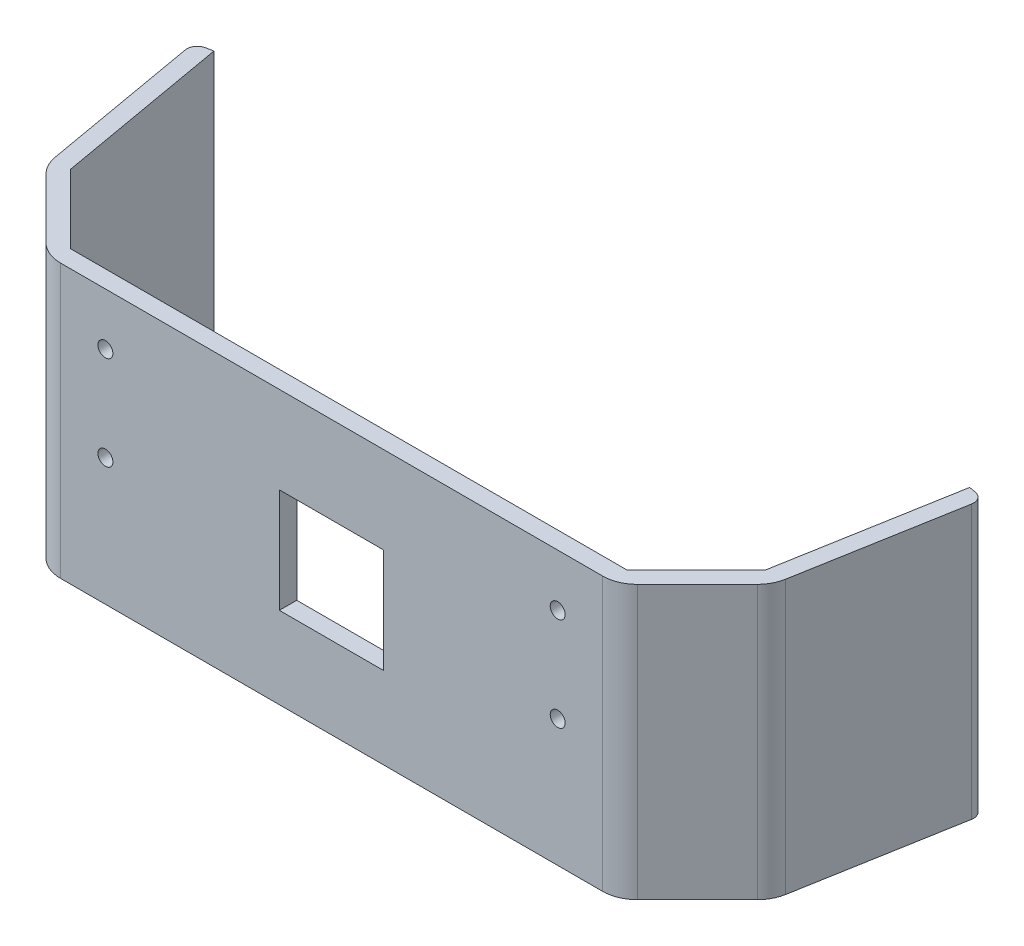
ISO-10303-21;
HEADER;
FILE_DESCRIPTION(('STEP AP214'),'2;1');
FILE_NAME('part.step','',(''),(''),'','','');
FILE_SCHEMA(('AUTOMOTIVE_DESIGN { 1 0 10303 214 1 1 1 1 }'));
ENDSEC;
DATA;
#1=APPLICATION_CONTEXT('core data for automotive mechanical design processes');
#2=APPLICATION_PROTOCOL_DEFINITION('international standard','automotive_design',2000,#1);
#3=PRODUCT_CONTEXT('',#1,'mechanical');
#4=PRODUCT('Part','Part','',(#3));
#5=PRODUCT_RELATED_PRODUCT_CATEGORY('part','',(#4));
#6=PRODUCT_DEFINITION_FORMATION('','',#4);
#7=PRODUCT_DEFINITION_CONTEXT('part definition',#1,'design');
#8=PRODUCT_DEFINITION('design','',#6,#7);
#9=PRODUCT_DEFINITION_SHAPE('','',#8);
#10=(LENGTH_UNIT() NAMED_UNIT(*) SI_UNIT(.MILLI.,.METRE.));
#11=(NAMED_UNIT(*) PLANE_ANGLE_UNIT() SI_UNIT($,.RADIAN.));
#12=(NAMED_UNIT(*) SI_UNIT($,.STERADIAN.) SOLID_ANGLE_UNIT());
#13=UNCERTAINTY_MEASURE_WITH_UNIT(LENGTH_MEASURE(1.E-05),#10,'distance_accuracy_value','');
#14=(GEOMETRIC_REPRESENTATION_CONTEXT(3) GLOBAL_UNCERTAINTY_ASSIGNED_CONTEXT((#13)) GLOBAL_UNIT_ASSIGNED_CONTEXT((#10,
#11,#12)) REPRESENTATION_CONTEXT('',''));
#15=CARTESIAN_POINT('',(0.,0.,0.));
#16=DIRECTION('',(0.,0.,1.));
#17=DIRECTION('',(1.,0.,0.));
#18=AXIS2_PLACEMENT_3D('',#15,#16,#17);
#19=CARTESIAN_POINT('',(99.7989898732233,78.5,-19.7989898732234));
#20=DIRECTION('',(-0.984807753012209,0.,-0.173648177666926));
#21=DIRECTION('',(-0.173648177666926,0.,0.984807753012209));
#22=AXIS2_PLACEMENT_3D('',#19,#20,#21);
#23=PLANE('',#22);
#24=DIRECTION('',(0.173648177666926,0.,-0.984807753012209));
#25=VECTOR('',#24,1.);
#26=CARTESIAN_POINT('',(99.7989898732233,0.,-19.7989898732234));
#27=LINE('',#26,#25);
#28=CARTESIAN_POINT('',(99.7989898732233,0.,-19.7989898732234));
#29=VERTEX_POINT('',#28);
#30=CARTESIAN_POINT('',(108.615338908646,0.,-69.7989898732234));
#31=VERTEX_POINT('',#30);
#32=EDGE_CURVE('E225',#29,#31,#27,.T.);
#33=ORIENTED_EDGE('',*,*,#32,.F.);
#34=DIRECTION('',(0.,-1.,0.));
#35=VECTOR('',#34,1.);
#36=CARTESIAN_POINT('',(99.7989898732233,78.5,-19.7989898732234));
#37=LINE('',#36,#35);
#38=CARTESIAN_POINT('',(99.7989898732233,78.5,-19.7989898732234));
#39=VERTEX_POINT('',#38);
#40=EDGE_CURVE('E287',#39,#29,#37,.T.);
#41=ORIENTED_EDGE('',*,*,#40,.F.);
#42=DIRECTION('',(0.173648177666926,0.,-0.984807753012209));
#43=VECTOR('',#42,1.);
#44=CARTESIAN_POINT('',(99.7989898732233,78.5,-19.7989898732234));
#45=LINE('',#44,#43);
#46=CARTESIAN_POINT('',(108.615338908646,78.5,-69.7989898732234));
#47=VERTEX_POINT('',#46);
#48=EDGE_CURVE('E221',#39,#47,#45,.T.);
#49=ORIENTED_EDGE('',*,*,#48,.T.);
#50=DIRECTION('',(0.,-1.,0.));
#51=VECTOR('',#50,1.);
#52=CARTESIAN_POINT('',(108.615338908646,78.5,-69.7989898732234));
#53=LINE('',#52,#51);
#54=EDGE_CURVE('E260',#47,#31,#53,.T.);
#55=ORIENTED_EDGE('',*,*,#54,.T.);
#56=EDGE_LOOP('',(#33,#41,#49,#55));
#57=FACE_BOUND('',#56,.T.);
#58=ADVANCED_FACE('F39',(#57),#23,.T.);
#59=CARTESIAN_POINT('',(80.,78.5,0.));
#60=DIRECTION('',(-0.70710678118655,0.,-0.707106781186545));
#61=DIRECTION('',(-0.707106781186545,0.,0.70710678118655));
#62=AXIS2_PLACEMENT_3D('',#59,#60,#61);
#63=PLANE('',#62);
#64=DIRECTION('',(0.707106781186545,0.,-0.70710678118655));
#65=VECTOR('',#64,1.);
#66=CARTESIAN_POINT('',(80.,0.,0.));
#67=LINE('',#66,#65);
#68=CARTESIAN_POINT('',(80.,0.,0.));
#69=VERTEX_POINT('',#68);
#70=EDGE_CURVE('E227',#69,#29,#67,.T.);
#71=ORIENTED_EDGE('',*,*,#70,.F.);
#72=DIRECTION('',(0.,-1.,0.));
#73=VECTOR('',#72,1.);
#74=CARTESIAN_POINT('',(80.,78.5,0.));
#75=LINE('',#74,#73);
#76=CARTESIAN_POINT('',(80.,78.5,0.));
#77=VERTEX_POINT('',#76);
#78=EDGE_CURVE('E292',#77,#69,#75,.T.);
#79=ORIENTED_EDGE('',*,*,#78,.F.);
#80=DIRECTION('',(0.707106781186545,0.,-0.70710678118655));
#81=VECTOR('',#80,1.);
#82=CARTESIAN_POINT('',(80.,78.5,0.));
#83=LINE('',#82,#81);
#84=EDGE_CURVE('E251',#77,#39,#83,.T.);
#85=ORIENTED_EDGE('',*,*,#84,.T.);
#86=ORIENTED_EDGE('',*,*,#40,.T.);
#87=EDGE_LOOP('',(#71,#79,#85,#86));
#88=FACE_BOUND('',#87,.T.);
#89=ADVANCED_FACE('F412',(#88),#63,.T.);
#90=CARTESIAN_POINT('',(-80.,78.5,0.));
#91=DIRECTION('',(0.,0.,-1.));
#92=DIRECTION('',(-1.,0.,0.));
#93=AXIS2_PLACEMENT_3D('',#90,#91,#92);
#94=PLANE('',#93);
#95=CARTESIAN_POINT('',(-65.,36.5,0.));
#96=DIRECTION('',(0.,0.,-1.));
#97=DIRECTION('',(-1.,0.,0.));
#98=AXIS2_PLACEMENT_3D('',#95,#96,#97);
#99=CIRCLE('',#98,2.15);
#100=CARTESIAN_POINT('',(-67.15,36.5,0.));
#101=VERTEX_POINT('',#100);
#102=EDGE_CURVE('E699',#101,#101,#99,.T.);
#103=ORIENTED_EDGE('',*,*,#102,.F.);
#104=EDGE_LOOP('',(#103));
#105=FACE_BOUND('',#104,.T.);
#106=CARTESIAN_POINT('',(-65.,63.5,0.));
#107=DIRECTION('',(0.,0.,-1.));
#108=DIRECTION('',(-1.,0.,0.));
#109=AXIS2_PLACEMENT_3D('',#106,#107,#108);
#110=CIRCLE('',#109,2.15);
#111=CARTESIAN_POINT('',(-67.15,63.5,0.));
#112=VERTEX_POINT('',#111);
#113=EDGE_CURVE('E700',#112,#112,#110,.T.);
#114=ORIENTED_EDGE('',*,*,#113,.F.);
#115=EDGE_LOOP('',(#114));
#116=FACE_BOUND('',#115,.T.);
#117=CARTESIAN_POINT('',(65.,63.5,0.));
#118=DIRECTION('',(0.,0.,-1.));
#119=DIRECTION('',(-1.,0.,0.));
#120=AXIS2_PLACEMENT_3D('',#117,#118,#119);
#121=CIRCLE('',#120,2.15);
#122=CARTESIAN_POINT('',(62.85,63.5,0.));
#123=VERTEX_POINT('',#122);
#124=EDGE_CURVE('E689',#123,#123,#121,.T.);
#125=ORIENTED_EDGE('',*,*,#124,.F.);
#126=EDGE_LOOP('',(#125));
#127=FACE_BOUND('',#126,.T.);
#128=CARTESIAN_POINT('',(65.,36.5,0.));
#129=DIRECTION('',(0.,0.,-1.));
#130=DIRECTION('',(-1.,0.,0.));
#131=AXIS2_PLACEMENT_3D('',#128,#129,#130);
#132=CIRCLE('',#131,2.15);
#133=CARTESIAN_POINT('',(62.85,36.5,0.));
#134=VERTEX_POINT('',#133);
#135=EDGE_CURVE('E688',#134,#134,#132,.T.);
#136=ORIENTED_EDGE('',*,*,#135,.F.);
#137=EDGE_LOOP('',(#136));
#138=FACE_BOUND('',#137,.T.);
#139=DIRECTION('',(-1.,0.,0.));
#140=VECTOR('',#139,1.);
#141=CARTESIAN_POINT('',(-80.,23.5,0.));
#142=LINE('',#141,#140);
#143=CARTESIAN_POINT('',(15.,23.5,0.));
#144=VERTEX_POINT('',#143);
#145=CARTESIAN_POINT('',(-15.,23.5,0.));
#146=VERTEX_POINT('',#145);
#147=EDGE_CURVE('E217',#144,#146,#142,.T.);
#148=ORIENTED_EDGE('',*,*,#147,.F.);
#149=DIRECTION('',(0.,1.,0.));
#150=VECTOR('',#149,1.);
#151=CARTESIAN_POINT('',(15.,78.5,0.));
#152=LINE('',#151,#150);
#153=CARTESIAN_POINT('',(15.,53.5,0.));
#154=VERTEX_POINT('',#153);
#155=EDGE_CURVE('E214',#144,#154,#152,.T.);
#156=ORIENTED_EDGE('',*,*,#155,.T.);
#157=DIRECTION('',(-1.,0.,0.));
#158=VECTOR('',#157,1.);
#159=CARTESIAN_POINT('',(-80.,53.5,0.));
#160=LINE('',#159,#158);
#161=CARTESIAN_POINT('',(-15.,53.5,0.));
#162=VERTEX_POINT('',#161);
#163=EDGE_CURVE('E194',#154,#162,#160,.T.);
#164=ORIENTED_EDGE('',*,*,#163,.T.);
#165=DIRECTION('',(0.,1.,0.));
#166=VECTOR('',#165,1.);
#167=CARTESIAN_POINT('',(-15.,78.5,0.));
#168=LINE('',#167,#166);
#169=EDGE_CURVE('E216',#146,#162,#168,.T.);
#170=ORIENTED_EDGE('',*,*,#169,.F.);
#171=EDGE_LOOP('',(#148,#156,#164,#170));
#172=FACE_BOUND('',#171,.T.);
#173=DIRECTION('',(1.,0.,0.));
#174=VECTOR('',#173,1.);
#175=CARTESIAN_POINT('',(-80.,0.,0.));
#176=LINE('',#175,#174);
#177=CARTESIAN_POINT('',(-80.,0.,0.));
#178=VERTEX_POINT('',#177);
#179=EDGE_CURVE('E284',#178,#69,#176,.T.);
#180=ORIENTED_EDGE('',*,*,#179,.F.);
#181=DIRECTION('',(0.,-1.,0.));
#182=VECTOR('',#181,1.);
#183=CARTESIAN_POINT('',(-80.,78.5,0.));
#184=LINE('',#183,#182);
#185=CARTESIAN_POINT('',(-80.,78.5,0.));
#186=VERTEX_POINT('',#185);
#187=EDGE_CURVE('E295',#186,#178,#184,.T.);
#188=ORIENTED_EDGE('',*,*,#187,.F.);
#189=DIRECTION('',(1.,0.,0.));
#190=VECTOR('',#189,1.);
#191=CARTESIAN_POINT('',(-80.,78.5,0.));
#192=LINE('',#191,#190);
#193=EDGE_CURVE('E252',#186,#77,#192,.T.);
#194=ORIENTED_EDGE('',*,*,#193,.T.);
#195=ORIENTED_EDGE('',*,*,#78,.T.);
#196=EDGE_LOOP('',(#180,#188,#194,#195));
#197=FACE_BOUND('',#196,.T.);
#198=ADVANCED_FACE('F416',(#105,#116,#127,#138,#172,#197),#94,.T.);
#199=CARTESIAN_POINT('',(-80.,78.5,0.));
#200=DIRECTION('',(-0.707106781186543,0.,0.707106781186552));
#201=DIRECTION('',(0.707106781186552,0.,0.707106781186543));
#202=AXIS2_PLACEMENT_3D('',#199,#200,#201);
#203=PLANE('',#202);
#204=DIRECTION('',(-0.707106781186551,0.,-0.707106781186543));
#205=VECTOR('',#204,1.);
#206=CARTESIAN_POINT('',(-80.,0.,0.));
#207=LINE('',#206,#205);
#208=CARTESIAN_POINT('',(-99.7989898732234,0.,-19.7989898732232));
#209=VERTEX_POINT('',#208);
#210=EDGE_CURVE('E285',#178,#209,#207,.T.);
#211=ORIENTED_EDGE('',*,*,#210,.T.);
#212=DIRECTION('',(0.,-1.,0.));
#213=VECTOR('',#212,1.);
#214=CARTESIAN_POINT('',(-99.7989898732234,78.5,-19.7989898732232));
#215=LINE('',#214,#213);
#216=CARTESIAN_POINT('',(-99.7989898732234,78.5,-19.7989898732232));
#217=VERTEX_POINT('',#216);
#218=EDGE_CURVE('E298',#217,#209,#215,.T.);
#219=ORIENTED_EDGE('',*,*,#218,.F.);
#220=DIRECTION('',(-0.707106781186551,0.,-0.707106781186543));
#221=VECTOR('',#220,1.);
#222=CARTESIAN_POINT('',(-80.,78.5,0.));
#223=LINE('',#222,#221);
#224=EDGE_CURVE('E248',#186,#217,#223,.T.);
#225=ORIENTED_EDGE('',*,*,#224,.F.);
#226=ORIENTED_EDGE('',*,*,#187,.T.);
#227=EDGE_LOOP('',(#211,#219,#225,#226));
#228=FACE_BOUND('',#227,.T.);
#229=ADVANCED_FACE('F424',(#228),#203,.F.);
#230=CARTESIAN_POINT('',(-99.7989898732234,78.5,-19.7989898732232));
#231=DIRECTION('',(-0.984807753012207,0.,0.173648177666935));
#232=DIRECTION('',(0.173648177666935,0.,0.984807753012207));
#233=AXIS2_PLACEMENT_3D('',#230,#231,#232);
#234=PLANE('',#233);
#235=DIRECTION('',(-0.173648177666935,0.,-0.984807753012207));
#236=VECTOR('',#235,1.);
#237=CARTESIAN_POINT('',(-99.7989898732234,0.,-19.7989898732232));
#238=LINE('',#237,#236);
#239=CARTESIAN_POINT('',(-108.615338908647,0.,-69.7989898732232));
#240=VERTEX_POINT('',#239);
#241=EDGE_CURVE('E276',#209,#240,#238,.T.);
#242=ORIENTED_EDGE('',*,*,#241,.T.);
#243=DIRECTION('',(0.,-1.,0.));
#244=VECTOR('',#243,1.);
#245=CARTESIAN_POINT('',(-108.615338908647,78.5,-69.7989898732232));
#246=LINE('',#245,#244);
#247=CARTESIAN_POINT('',(-108.615338908647,78.5,-69.7989898732232));
#248=VERTEX_POINT('',#247);
#249=EDGE_CURVE('E299',#248,#240,#246,.T.);
#250=ORIENTED_EDGE('',*,*,#249,.F.);
#251=DIRECTION('',(-0.173648177666935,0.,-0.984807753012207));
#252=VECTOR('',#251,1.);
#253=CARTESIAN_POINT('',(-99.7989898732234,78.5,-19.7989898732232));
#254=LINE('',#253,#252);
#255=EDGE_CURVE('E246',#217,#248,#254,.T.);
#256=ORIENTED_EDGE('',*,*,#255,.F.);
#257=ORIENTED_EDGE('',*,*,#218,.T.);
#258=EDGE_LOOP('',(#242,#250,#256,#257));
#259=FACE_BOUND('',#258,.T.);
#260=ADVANCED_FACE('F429',(#259),#234,.F.);
#261=CARTESIAN_POINT('',(-113.539377673708,78.5,-68.9307489848886));
#262=DIRECTION('',(-0.173648177666935,0.,-0.984807753012207));
#263=DIRECTION('',(-0.984807753012207,0.,0.173648177666935));
#264=AXIS2_PLACEMENT_3D('',#261,#262,#263);
#265=PLANE('',#264);
#266=DIRECTION('',(0.984807753012207,0.,-0.173648177666935));
#267=VECTOR('',#266,1.);
#268=CARTESIAN_POINT('',(-113.539377673708,0.,-68.9307489848886));
#269=LINE('',#268,#267);
#270=CARTESIAN_POINT('',(-110.584954414671,0.,-69.4516935178894));
#271=VERTEX_POINT('',#270);
#272=EDGE_CURVE('E280',#271,#240,#269,.T.);
#273=ORIENTED_EDGE('',*,*,#272,.F.);
#274=DIRECTION('',(0.,-1.,0.));
#275=VECTOR('',#274,1.);
#276=CARTESIAN_POINT('',(-110.584954414671,78.5,-69.4516935178894));
#277=LINE('',#276,#275);
#278=CARTESIAN_POINT('',(-110.584954414671,78.5,-69.4516935178894));
#279=VERTEX_POINT('',#278);
#280=EDGE_CURVE('E11',#271,#279,#277,.F.);
#281=ORIENTED_EDGE('',*,*,#280,.T.);
#282=DIRECTION('',(0.984807753012207,0.,-0.173648177666935));
#283=VECTOR('',#282,1.);
#284=CARTESIAN_POINT('',(-113.539377673708,78.5,-68.9307489848886));
#285=LINE('',#284,#283);
#286=EDGE_CURVE('E242',#279,#248,#285,.T.);
#287=ORIENTED_EDGE('',*,*,#286,.T.);
#288=ORIENTED_EDGE('',*,*,#249,.T.);
#289=EDGE_LOOP('',(#273,#281,#287,#288));
#290=FACE_BOUND('',#289,.T.);
#291=ADVANCED_FACE('F431',(#290),#265,.T.);
#292=CARTESIAN_POINT('',(-104.449273337737,78.5,-17.3782055258716));
#293=DIRECTION('',(-0.984807753012207,0.,0.173648177666934));
#294=DIRECTION('',(0.173648177666934,0.,0.984807753012207));
#295=AXIS2_PLACEMENT_3D('',#292,#293,#294);
#296=PLANE('',#295);
#297=DIRECTION('',(-0.173648177666934,0.,-0.984807753012207));
#298=VECTOR('',#297,1.);
#299=CARTESIAN_POINT('',(-104.449273337737,78.5,-17.3782055258716));
#300=LINE('',#299,#298);
#301=CARTESIAN_POINT('',(-104.996783938832,78.5,-20.4832924439055));
#302=VERTEX_POINT('',#301);
#303=CARTESIAN_POINT('',(-113.018433140707,78.5,-65.9763257258519));
#304=VERTEX_POINT('',#303);
#305=EDGE_CURVE('E241',#302,#304,#300,.T.);
#306=ORIENTED_EDGE('',*,*,#305,.T.);
#307=DIRECTION('',(0.,-1.,0.));
#308=VECTOR('',#307,1.);
#309=CARTESIAN_POINT('',(-113.018433140707,78.5,-65.9763257258519));
#310=LINE('',#309,#308);
#311=CARTESIAN_POINT('',(-113.018433140707,0.,-65.9763257258519));
#312=VERTEX_POINT('',#311);
#313=EDGE_CURVE('E50',#304,#312,#310,.T.);
#314=ORIENTED_EDGE('',*,*,#313,.T.);
#315=DIRECTION('',(-0.173648177666934,0.,-0.984807753012207));
#316=VECTOR('',#315,1.);
#317=CARTESIAN_POINT('',(-104.449273337737,0.,-17.3782055258716));
#318=LINE('',#317,#316);
#319=CARTESIAN_POINT('',(-104.996783938832,0.,-20.4832924439055));
#320=VERTEX_POINT('',#319);
#321=EDGE_CURVE('E274',#320,#312,#318,.T.);
#322=ORIENTED_EDGE('',*,*,#321,.F.);
#323=DIRECTION('',(0.,-1.,0.));
#324=VECTOR('',#323,1.);
#325=CARTESIAN_POINT('',(-104.996783938832,78.5,-20.4832924439055));
#326=LINE('',#325,#324);
#327=EDGE_CURVE('E336',#320,#302,#326,.F.);
#328=ORIENTED_EDGE('',*,*,#327,.T.);
#329=EDGE_LOOP('',(#306,#314,#322,#328));
#330=FACE_BOUND('',#329,.T.);
#331=ADVANCED_FACE('F358',(#330),#296,.T.);
#332=CARTESIAN_POINT('',(-82.0710678118654,78.5,5.));
#333=DIRECTION('',(-0.707106781186543,0.,0.707106781186552));
#334=DIRECTION('',(0.707106781186552,0.,0.707106781186543));
#335=AXIS2_PLACEMENT_3D('',#332,#333,#334);
#336=PLANE('',#335);
#337=DIRECTION('',(-0.707106781186552,0.,-0.707106781186543));
#338=VECTOR('',#337,1.);
#339=CARTESIAN_POINT('',(-82.0710678118654,0.,5.));
#340=LINE('',#339,#338);
#341=CARTESIAN_POINT('',(-85.,0.,2.07106781186552));
#342=VERTEX_POINT('',#341);
#343=CARTESIAN_POINT('',(-102.219774220575,0.,-15.1487064087093));
#344=VERTEX_POINT('',#343);
#345=EDGE_CURVE('E272',#342,#344,#340,.T.);
#346=ORIENTED_EDGE('',*,*,#345,.F.);
#347=DIRECTION('',(0.,-1.,0.));
#348=VECTOR('',#347,1.);
#349=CARTESIAN_POINT('',(-85.,78.5,2.07106781186552));
#350=LINE('',#349,#348);
#351=CARTESIAN_POINT('',(-85.,78.5,2.07106781186552));
#352=VERTEX_POINT('',#351);
#353=EDGE_CURVE('E335',#342,#352,#350,.F.);
#354=ORIENTED_EDGE('',*,*,#353,.T.);
#355=DIRECTION('',(-0.707106781186552,0.,-0.707106781186543));
#356=VECTOR('',#355,1.);
#357=CARTESIAN_POINT('',(-82.0710678118654,78.5,5.));
#358=LINE('',#357,#356);
#359=CARTESIAN_POINT('',(-102.219774220575,78.5,-15.1487064087093));
#360=VERTEX_POINT('',#359);
#361=EDGE_CURVE('E238',#352,#360,#358,.T.);
#362=ORIENTED_EDGE('',*,*,#361,.T.);
#363=DIRECTION('',(0.,-1.,0.));
#364=VECTOR('',#363,1.);
#365=CARTESIAN_POINT('',(-102.219774220575,78.5,-15.1487064087093));
#366=LINE('',#365,#364);
#367=EDGE_CURVE('E329',#360,#344,#366,.T.);
#368=ORIENTED_EDGE('',*,*,#367,.T.);
#369=EDGE_LOOP('',(#346,#354,#362,#368));
#370=FACE_BOUND('',#369,.T.);
#371=ADVANCED_FACE('F369',(#370),#336,.T.);
#372=CARTESIAN_POINT('',(-82.0710678118654,78.5,5.));
#373=DIRECTION('',(0.,0.,-1.));
#374=DIRECTION('',(-1.,0.,0.));
#375=AXIS2_PLACEMENT_3D('',#372,#373,#374);
#376=PLANE('',#375);
#377=CARTESIAN_POINT('',(-65.,36.5,5.));
#378=DIRECTION('',(0.,0.,1.));
#379=DIRECTION('',(1.,0.,0.));
#380=AXIS2_PLACEMENT_3D('',#377,#378,#379);
#381=CIRCLE('',#380,2.15);
#382=CARTESIAN_POINT('',(-62.85,36.5,5.));
#383=VERTEX_POINT('',#382);
#384=EDGE_CURVE('E671',#383,#383,#381,.T.);
#385=ORIENTED_EDGE('',*,*,#384,.F.);
#386=EDGE_LOOP('',(#385));
#387=FACE_BOUND('',#386,.T.);
#388=CARTESIAN_POINT('',(-65.,63.5,5.));
#389=DIRECTION('',(0.,0.,1.));
#390=DIRECTION('',(1.,0.,0.));
#391=AXIS2_PLACEMENT_3D('',#388,#389,#390);
#392=CIRCLE('',#391,2.15);
#393=CARTESIAN_POINT('',(-62.85,63.5,5.));
#394=VERTEX_POINT('',#393);
#395=EDGE_CURVE('E680',#394,#394,#392,.T.);
#396=ORIENTED_EDGE('',*,*,#395,.F.);
#397=EDGE_LOOP('',(#396));
#398=FACE_BOUND('',#397,.T.);
#399=CARTESIAN_POINT('',(65.,63.5,5.));
#400=DIRECTION('',(0.,0.,1.));
#401=DIRECTION('',(1.,0.,0.));
#402=AXIS2_PLACEMENT_3D('',#399,#400,#401);
#403=CIRCLE('',#402,2.15);
#404=CARTESIAN_POINT('',(67.15,63.5,5.));
#405=VERTEX_POINT('',#404);
#406=EDGE_CURVE('E683',#405,#405,#403,.T.);
#407=ORIENTED_EDGE('',*,*,#406,.F.);
#408=EDGE_LOOP('',(#407));
#409=FACE_BOUND('',#408,.T.);
#410=CARTESIAN_POINT('',(65.,36.5,5.));
#411=DIRECTION('',(0.,0.,1.));
#412=DIRECTION('',(1.,0.,0.));
#413=AXIS2_PLACEMENT_3D('',#410,#411,#412);
#414=CIRCLE('',#413,2.15);
#415=CARTESIAN_POINT('',(67.15,36.5,5.));
#416=VERTEX_POINT('',#415);
#417=EDGE_CURVE('E685',#416,#416,#414,.T.);
#418=ORIENTED_EDGE('',*,*,#417,.F.);
#419=EDGE_LOOP('',(#418));
#420=FACE_BOUND('',#419,.T.);
#421=DIRECTION('',(0.,-1.,0.));
#422=VECTOR('',#421,1.);
#423=CARTESIAN_POINT('',(15.,53.5,5.));
#424=LINE('',#423,#422);
#425=CARTESIAN_POINT('',(15.,53.5,5.));
#426=VERTEX_POINT('',#425);
#427=CARTESIAN_POINT('',(15.,23.5,5.));
#428=VERTEX_POINT('',#427);
#429=EDGE_CURVE('E199',#426,#428,#424,.T.);
#430=ORIENTED_EDGE('',*,*,#429,.T.);
#431=DIRECTION('',(1.,0.,0.));
#432=VECTOR('',#431,1.);
#433=CARTESIAN_POINT('',(-15.,23.5,5.));
#434=LINE('',#433,#432);
#435=CARTESIAN_POINT('',(-15.,23.5,5.));
#436=VERTEX_POINT('',#435);
#437=EDGE_CURVE('E65',#436,#428,#434,.T.);
#438=ORIENTED_EDGE('',*,*,#437,.F.);
#439=DIRECTION('',(0.,-1.,0.));
#440=VECTOR('',#439,1.);
#441=CARTESIAN_POINT('',(-15.,53.5,5.));
#442=LINE('',#441,#440);
#443=CARTESIAN_POINT('',(-15.,53.5,5.));
#444=VERTEX_POINT('',#443);
#445=EDGE_CURVE('E207',#444,#436,#442,.T.);
#446=ORIENTED_EDGE('',*,*,#445,.F.);
#447=DIRECTION('',(1.,0.,0.));
#448=VECTOR('',#447,1.);
#449=CARTESIAN_POINT('',(-15.,53.5,5.));
#450=LINE('',#449,#448);
#451=EDGE_CURVE('E188',#444,#426,#450,.T.);
#452=ORIENTED_EDGE('',*,*,#451,.T.);
#453=EDGE_LOOP('',(#430,#438,#446,#452));
#454=FACE_BOUND('',#453,.T.);
#455=DIRECTION('',(1.,0.,0.));
#456=VECTOR('',#455,1.);
#457=CARTESIAN_POINT('',(-82.0710678118654,78.5,5.));
#458=LINE('',#457,#456);
#459=CARTESIAN_POINT('',(-77.9289321881345,78.5,5.));
#460=VERTEX_POINT('',#459);
#461=CARTESIAN_POINT('',(77.9289321881345,78.5,5.));
#462=VERTEX_POINT('',#461);
#463=EDGE_CURVE('E236',#460,#462,#458,.T.);
#464=ORIENTED_EDGE('',*,*,#463,.F.);
#465=DIRECTION('',(0.,-1.,0.));
#466=VECTOR('',#465,1.);
#467=CARTESIAN_POINT('',(-77.9289321881345,0.,5.));
#468=LINE('',#467,#466);
#469=CARTESIAN_POINT('',(-77.9289321881345,0.,5.));
#470=VERTEX_POINT('',#469);
#471=EDGE_CURVE('E325',#460,#470,#468,.T.);
#472=ORIENTED_EDGE('',*,*,#471,.T.);
#473=DIRECTION('',(1.,0.,0.));
#474=VECTOR('',#473,1.);
#475=CARTESIAN_POINT('',(-82.0710678118654,0.,5.));
#476=LINE('',#475,#474);
#477=CARTESIAN_POINT('',(77.9289321881345,0.,5.));
#478=VERTEX_POINT('',#477);
#479=EDGE_CURVE('E267',#470,#478,#476,.T.);
#480=ORIENTED_EDGE('',*,*,#479,.T.);
#481=DIRECTION('',(0.,-1.,0.));
#482=VECTOR('',#481,1.);
#483=CARTESIAN_POINT('',(77.9289321881345,78.5,5.));
#484=LINE('',#483,#482);
#485=EDGE_CURVE('E308',#478,#462,#484,.F.);
#486=ORIENTED_EDGE('',*,*,#485,.T.);
#487=EDGE_LOOP('',(#464,#472,#480,#486));
#488=FACE_BOUND('',#487,.T.);
#489=ADVANCED_FACE('F201',(#387,#398,#409,#420,#454,#488),#376,.F.);
#490=CARTESIAN_POINT('',(82.0710678118654,78.5,5.));
#491=DIRECTION('',(-0.707106781186549,0.,-0.707106781186546));
#492=DIRECTION('',(-0.707106781186546,0.,0.707106781186549));
#493=AXIS2_PLACEMENT_3D('',#490,#491,#492);
#494=PLANE('',#493);
#495=DIRECTION('',(0.707106781186546,0.,-0.707106781186549));
#496=VECTOR('',#495,1.);
#497=CARTESIAN_POINT('',(82.0710678118654,0.,5.));
#498=LINE('',#497,#496);
#499=CARTESIAN_POINT('',(85.,0.,2.07106781186546));
#500=VERTEX_POINT('',#499);
#501=CARTESIAN_POINT('',(102.219774220575,0.,-15.1487064087095));
#502=VERTEX_POINT('',#501);
#503=EDGE_CURVE('E268',#500,#502,#498,.T.);
#504=ORIENTED_EDGE('',*,*,#503,.T.);
#505=DIRECTION('',(0.,-1.,0.));
#506=VECTOR('',#505,1.);
#507=CARTESIAN_POINT('',(102.219774220575,78.5,-15.1487064087095));
#508=LINE('',#507,#506);
#509=CARTESIAN_POINT('',(102.219774220575,78.5,-15.1487064087095));
#510=VERTEX_POINT('',#509);
#511=EDGE_CURVE('E319',#502,#510,#508,.F.);
#512=ORIENTED_EDGE('',*,*,#511,.T.);
#513=DIRECTION('',(0.707106781186546,0.,-0.707106781186549));
#514=VECTOR('',#513,1.);
#515=CARTESIAN_POINT('',(82.0710678118654,78.5,5.));
#516=LINE('',#515,#514);
#517=CARTESIAN_POINT('',(85.,78.5,2.07106781186546));
#518=VERTEX_POINT('',#517);
#519=EDGE_CURVE('E231',#518,#510,#516,.T.);
#520=ORIENTED_EDGE('',*,*,#519,.F.);
#521=DIRECTION('',(0.,-1.,0.));
#522=VECTOR('',#521,1.);
#523=CARTESIAN_POINT('',(85.,78.5,2.07106781186546));
#524=LINE('',#523,#522);
#525=EDGE_CURVE('E293',#518,#500,#524,.T.);
#526=ORIENTED_EDGE('',*,*,#525,.T.);
#527=EDGE_LOOP('',(#504,#512,#520,#526));
#528=FACE_BOUND('',#527,.T.);
#529=ADVANCED_FACE('F388',(#528),#494,.F.);
#530=CARTESIAN_POINT('',(104.449273337737,78.5,-17.3782055258719));
#531=DIRECTION('',(-0.984807753012209,0.,-0.173648177666926));
#532=DIRECTION('',(-0.173648177666926,0.,0.984807753012209));
#533=AXIS2_PLACEMENT_3D('',#530,#531,#532);
#534=PLANE('',#533);
#535=DIRECTION('',(0.173648177666926,0.,-0.984807753012209));
#536=VECTOR('',#535,1.);
#537=CARTESIAN_POINT('',(104.449273337737,0.,-17.3782055258719));
#538=LINE('',#537,#536);
#539=CARTESIAN_POINT('',(104.996783938831,0.,-20.4832924439057));
#540=VERTEX_POINT('',#539);
#541=CARTESIAN_POINT('',(113.018433140707,0.,-65.9763257258522));
#542=VERTEX_POINT('',#541);
#543=EDGE_CURVE('E261',#540,#542,#538,.T.);
#544=ORIENTED_EDGE('',*,*,#543,.T.);
#545=DIRECTION('',(0.,-1.,0.));
#546=VECTOR('',#545,1.);
#547=CARTESIAN_POINT('',(113.018433140707,78.5,-65.9763257258522));
#548=LINE('',#547,#546);
#549=CARTESIAN_POINT('',(113.018433140707,78.5,-65.9763257258522));
#550=VERTEX_POINT('',#549);
#551=EDGE_CURVE('E350',#542,#550,#548,.F.);
#552=ORIENTED_EDGE('',*,*,#551,.T.);
#553=DIRECTION('',(0.173648177666926,0.,-0.984807753012209));
#554=VECTOR('',#553,1.);
#555=CARTESIAN_POINT('',(104.449273337737,78.5,-17.3782055258719));
#556=LINE('',#555,#554);
#557=CARTESIAN_POINT('',(104.996783938831,78.5,-20.4832924439057));
#558=VERTEX_POINT('',#557);
#559=EDGE_CURVE('E229',#558,#550,#556,.T.);
#560=ORIENTED_EDGE('',*,*,#559,.F.);
#561=DIRECTION('',(0.,-1.,0.));
#562=VECTOR('',#561,1.);
#563=CARTESIAN_POINT('',(104.996783938831,78.5,-20.4832924439057));
#564=LINE('',#563,#562);
#565=EDGE_CURVE('E312',#558,#540,#564,.T.);
#566=ORIENTED_EDGE('',*,*,#565,.T.);
#567=EDGE_LOOP('',(#544,#552,#560,#566));
#568=FACE_BOUND('',#567,.T.);
#569=ADVANCED_FACE('F396',(#568),#534,.F.);
#570=CARTESIAN_POINT('',(108.615338908646,78.5,-69.7989898732234));
#571=DIRECTION('',(0.173648177666927,0.,-0.984807753012209));
#572=DIRECTION('',(-0.984807753012209,0.,-0.173648177666927));
#573=AXIS2_PLACEMENT_3D('',#570,#571,#572);
#574=PLANE('',#573);
#575=DIRECTION('',(0.984807753012209,0.,0.173648177666927));
#576=VECTOR('',#575,1.);
#577=CARTESIAN_POINT('',(108.615338908646,78.5,-69.7989898732234));
#578=LINE('',#577,#576);
#579=CARTESIAN_POINT('',(110.584954414671,78.5,-69.4516935178896));
#580=VERTEX_POINT('',#579);
#581=EDGE_CURVE('E228',#47,#580,#578,.T.);
#582=ORIENTED_EDGE('',*,*,#581,.T.);
#583=DIRECTION('',(0.,-1.,0.));
#584=VECTOR('',#583,1.);
#585=CARTESIAN_POINT('',(110.584954414671,0.,-69.4516935178896));
#586=LINE('',#585,#584);
#587=CARTESIAN_POINT('',(110.584954414671,0.,-69.4516935178896));
#588=VERTEX_POINT('',#587);
#589=EDGE_CURVE('E338',#580,#588,#586,.T.);
#590=ORIENTED_EDGE('',*,*,#589,.T.);
#591=DIRECTION('',(0.984807753012209,0.,0.173648177666927));
#592=VECTOR('',#591,1.);
#593=CARTESIAN_POINT('',(108.615338908646,0.,-69.7989898732234));
#594=LINE('',#593,#592);
#595=EDGE_CURVE('E258',#31,#588,#594,.T.);
#596=ORIENTED_EDGE('',*,*,#595,.F.);
#597=ORIENTED_EDGE('',*,*,#54,.F.);
#598=EDGE_LOOP('',(#582,#590,#596,#597));
#599=FACE_BOUND('',#598,.T.);
#600=ADVANCED_FACE('F410',(#599),#574,.T.);
#601=CARTESIAN_POINT('',(0.,78.5,0.));
#602=DIRECTION('',(0.,-1.,0.));
#603=DIRECTION('',(0.,0.,-1.));
#604=AXIS2_PLACEMENT_3D('',#601,#602,#603);
#605=PLANE('',#604);
#606=ORIENTED_EDGE('',*,*,#559,.T.);
#607=CARTESIAN_POINT('',(110.06400988167,78.5,-66.4972702588529));
#608=DIRECTION('',(0.,-1.,0.));
#609=DIRECTION('',(0.,0.,-1.));
#610=AXIS2_PLACEMENT_3D('',#607,#608,#609);
#611=CIRCLE('',#610,3.);
#612=EDGE_CURVE('E353',#550,#580,#611,.F.);
#613=ORIENTED_EDGE('',*,*,#612,.T.);
#614=ORIENTED_EDGE('',*,*,#581,.F.);
#615=ORIENTED_EDGE('',*,*,#48,.F.);
#616=ORIENTED_EDGE('',*,*,#84,.F.);
#617=ORIENTED_EDGE('',*,*,#193,.F.);
#618=ORIENTED_EDGE('',*,*,#224,.T.);
#619=ORIENTED_EDGE('',*,*,#255,.T.);
#620=ORIENTED_EDGE('',*,*,#286,.F.);
#621=CARTESIAN_POINT('',(-110.064009881671,78.5,-66.4972702588527));
#622=DIRECTION('',(0.,-1.,0.));
#623=DIRECTION('',(0.,0.,-1.));
#624=AXIS2_PLACEMENT_3D('',#621,#622,#623);
#625=CIRCLE('',#624,3.);
#626=EDGE_CURVE('E349',#279,#304,#625,.F.);
#627=ORIENTED_EDGE('',*,*,#626,.T.);
#628=ORIENTED_EDGE('',*,*,#305,.F.);
#629=CARTESIAN_POINT('',(-95.1487064087096,78.5,-22.2197742205748));
#630=DIRECTION('',(0.,-1.,0.));
#631=DIRECTION('',(0.,0.,-1.));
#632=AXIS2_PLACEMENT_3D('',#629,#630,#631);
#633=CIRCLE('',#632,10.);
#634=EDGE_CURVE('E332',#302,#360,#633,.F.);
#635=ORIENTED_EDGE('',*,*,#634,.T.);
#636=ORIENTED_EDGE('',*,*,#361,.F.);
#637=CARTESIAN_POINT('',(-77.9289321881345,78.5,-5.));
#638=DIRECTION('',(0.,-1.,0.));
#639=DIRECTION('',(0.,0.,-1.));
#640=AXIS2_PLACEMENT_3D('',#637,#638,#639);
#641=CIRCLE('',#640,10.);
#642=EDGE_CURVE('E337',#352,#460,#641,.F.);
#643=ORIENTED_EDGE('',*,*,#642,.T.);
#644=ORIENTED_EDGE('',*,*,#463,.T.);
#645=CARTESIAN_POINT('',(77.9289321881345,78.5,-5.));
#646=DIRECTION('',(0.,-1.,0.));
#647=DIRECTION('',(0.,0.,-1.));
#648=AXIS2_PLACEMENT_3D('',#645,#646,#647);
#649=CIRCLE('',#648,10.);
#650=EDGE_CURVE('E311',#462,#518,#649,.F.);
#651=ORIENTED_EDGE('',*,*,#650,.T.);
#652=ORIENTED_EDGE('',*,*,#519,.T.);
#653=CARTESIAN_POINT('',(95.1487064087094,78.5,-22.219774220575));
#654=DIRECTION('',(0.,-1.,0.));
#655=DIRECTION('',(0.,0.,-1.));
#656=AXIS2_PLACEMENT_3D('',#653,#654,#655);
#657=CIRCLE('',#656,10.);
#658=EDGE_CURVE('E318',#510,#558,#657,.F.);
#659=ORIENTED_EDGE('',*,*,#658,.T.);
#660=EDGE_LOOP('',(#606,#613,#614,#615,#616,#617,#618,#619,#620,#627,#628,#635,#636,#643,#644,
#651,#652,#659));
#661=FACE_BOUND('',#660,.T.);
#662=ADVANCED_FACE('F374',(#661),#605,.F.);
#663=CARTESIAN_POINT('',(0.,0.,0.));
#664=DIRECTION('',(0.,-1.,0.));
#665=DIRECTION('',(0.,0.,-1.));
#666=AXIS2_PLACEMENT_3D('',#663,#664,#665);
#667=PLANE('',#666);
#668=ORIENTED_EDGE('',*,*,#595,.T.);
#669=CARTESIAN_POINT('',(110.06400988167,0.,-66.4972702588529));
#670=DIRECTION('',(0.,-1.,0.));
#671=DIRECTION('',(0.,0.,-1.));
#672=AXIS2_PLACEMENT_3D('',#669,#670,#671);
#673=CIRCLE('',#672,3.);
#674=EDGE_CURVE('E343',#588,#542,#673,.T.);
#675=ORIENTED_EDGE('',*,*,#674,.T.);
#676=ORIENTED_EDGE('',*,*,#543,.F.);
#677=CARTESIAN_POINT('',(95.1487064087094,0.,-22.219774220575));
#678=DIRECTION('',(0.,-1.,0.));
#679=DIRECTION('',(0.,0.,-1.));
#680=AXIS2_PLACEMENT_3D('',#677,#678,#679);
#681=CIRCLE('',#680,10.);
#682=EDGE_CURVE('E317',#540,#502,#681,.T.);
#683=ORIENTED_EDGE('',*,*,#682,.T.);
#684=ORIENTED_EDGE('',*,*,#503,.F.);
#685=CARTESIAN_POINT('',(77.9289321881345,0.,-5.));
#686=DIRECTION('',(0.,-1.,0.));
#687=DIRECTION('',(0.,0.,-1.));
#688=AXIS2_PLACEMENT_3D('',#685,#686,#687);
#689=CIRCLE('',#688,10.);
#690=EDGE_CURVE('E304',#500,#478,#689,.T.);
#691=ORIENTED_EDGE('',*,*,#690,.T.);
#692=ORIENTED_EDGE('',*,*,#479,.F.);
#693=CARTESIAN_POINT('',(-77.9289321881345,0.,-5.));
#694=DIRECTION('',(0.,-1.,0.));
#695=DIRECTION('',(0.,0.,-1.));
#696=AXIS2_PLACEMENT_3D('',#693,#694,#695);
#697=CIRCLE('',#696,10.);
#698=EDGE_CURVE('E330',#470,#342,#697,.T.);
#699=ORIENTED_EDGE('',*,*,#698,.T.);
#700=ORIENTED_EDGE('',*,*,#345,.T.);
#701=CARTESIAN_POINT('',(-95.1487064087096,0.,-22.2197742205748));
#702=DIRECTION('',(0.,-1.,0.));
#703=DIRECTION('',(0.,0.,-1.));
#704=AXIS2_PLACEMENT_3D('',#701,#702,#703);
#705=CIRCLE('',#704,10.);
#706=EDGE_CURVE('E323',#344,#320,#705,.T.);
#707=ORIENTED_EDGE('',*,*,#706,.T.);
#708=ORIENTED_EDGE('',*,*,#321,.T.);
#709=CARTESIAN_POINT('',(-110.064009881671,0.,-66.4972702588527));
#710=DIRECTION('',(0.,-1.,0.));
#711=DIRECTION('',(0.,0.,-1.));
#712=AXIS2_PLACEMENT_3D('',#709,#710,#711);
#713=CIRCLE('',#712,3.);
#714=EDGE_CURVE('E344',#312,#271,#713,.T.);
#715=ORIENTED_EDGE('',*,*,#714,.T.);
#716=ORIENTED_EDGE('',*,*,#272,.T.);
#717=ORIENTED_EDGE('',*,*,#241,.F.);
#718=ORIENTED_EDGE('',*,*,#210,.F.);
#719=ORIENTED_EDGE('',*,*,#179,.T.);
#720=ORIENTED_EDGE('',*,*,#70,.T.);
#721=ORIENTED_EDGE('',*,*,#32,.T.);
#722=EDGE_LOOP('',(#668,#675,#676,#683,#684,#691,#692,#699,#700,#707,#708,#715,#716,#717,#718,
#719,#720,#721));
#723=FACE_BOUND('',#722,.T.);
#724=ADVANCED_FACE('F365',(#723),#667,.T.);
#725=CARTESIAN_POINT('',(77.9289321881345,78.5,-5.));
#726=DIRECTION('',(0.,-1.,0.));
#727=DIRECTION('',(0.,0.,-1.));
#728=AXIS2_PLACEMENT_3D('',#725,#726,#727);
#729=CYLINDRICAL_SURFACE('',#728,10.);
#730=ORIENTED_EDGE('',*,*,#650,.F.);
#731=ORIENTED_EDGE('',*,*,#485,.F.);
#732=ORIENTED_EDGE('',*,*,#690,.F.);
#733=ORIENTED_EDGE('',*,*,#525,.F.);
#734=EDGE_LOOP('',(#730,#731,#732,#733));
#735=FACE_BOUND('',#734,.T.);
#736=ADVANCED_FACE('F387',(#735),#729,.T.);
#737=CARTESIAN_POINT('',(95.1487064087094,78.5,-22.219774220575));
#738=DIRECTION('',(0.,-1.,0.));
#739=DIRECTION('',(0.,0.,-1.));
#740=AXIS2_PLACEMENT_3D('',#737,#738,#739);
#741=CYLINDRICAL_SURFACE('',#740,10.);
#742=ORIENTED_EDGE('',*,*,#658,.F.);
#743=ORIENTED_EDGE('',*,*,#511,.F.);
#744=ORIENTED_EDGE('',*,*,#682,.F.);
#745=ORIENTED_EDGE('',*,*,#565,.F.);
#746=EDGE_LOOP('',(#742,#743,#744,#745));
#747=FACE_BOUND('',#746,.T.);
#748=ADVANCED_FACE('F391',(#747),#741,.T.);
#749=CARTESIAN_POINT('',(-77.9289321881345,78.5,-5.));
#750=DIRECTION('',(0.,1.,0.));
#751=DIRECTION('',(0.,0.,1.));
#752=AXIS2_PLACEMENT_3D('',#749,#750,#751);
#753=CYLINDRICAL_SURFACE('',#752,10.);
#754=ORIENTED_EDGE('',*,*,#642,.F.);
#755=ORIENTED_EDGE('',*,*,#353,.F.);
#756=ORIENTED_EDGE('',*,*,#698,.F.);
#757=ORIENTED_EDGE('',*,*,#471,.F.);
#758=EDGE_LOOP('',(#754,#755,#756,#757));
#759=FACE_BOUND('',#758,.T.);
#760=ADVANCED_FACE('F378',(#759),#753,.T.);
#761=CARTESIAN_POINT('',(-95.1487064087096,78.5,-22.2197742205748));
#762=DIRECTION('',(0.,-1.,0.));
#763=DIRECTION('',(0.,0.,-1.));
#764=AXIS2_PLACEMENT_3D('',#761,#762,#763);
#765=CYLINDRICAL_SURFACE('',#764,10.);
#766=ORIENTED_EDGE('',*,*,#634,.F.);
#767=ORIENTED_EDGE('',*,*,#327,.F.);
#768=ORIENTED_EDGE('',*,*,#706,.F.);
#769=ORIENTED_EDGE('',*,*,#367,.F.);
#770=EDGE_LOOP('',(#766,#767,#768,#769));
#771=FACE_BOUND('',#770,.T.);
#772=ADVANCED_FACE('F368',(#771),#765,.T.);
#773=CARTESIAN_POINT('',(110.06400988167,78.5,-66.4972702588529));
#774=DIRECTION('',(0.,1.,0.));
#775=DIRECTION('',(0.,0.,1.));
#776=AXIS2_PLACEMENT_3D('',#773,#774,#775);
#777=CYLINDRICAL_SURFACE('',#776,3.);
#778=ORIENTED_EDGE('',*,*,#612,.F.);
#779=ORIENTED_EDGE('',*,*,#551,.F.);
#780=ORIENTED_EDGE('',*,*,#674,.F.);
#781=ORIENTED_EDGE('',*,*,#589,.F.);
#782=EDGE_LOOP('',(#778,#779,#780,#781));
#783=FACE_BOUND('',#782,.T.);
#784=ADVANCED_FACE('F405',(#783),#777,.T.);
#785=CARTESIAN_POINT('',(-110.064009881671,78.5,-66.4972702588527));
#786=DIRECTION('',(0.,-1.,0.));
#787=DIRECTION('',(0.,0.,-1.));
#788=AXIS2_PLACEMENT_3D('',#785,#786,#787);
#789=CYLINDRICAL_SURFACE('',#788,3.);
#790=ORIENTED_EDGE('',*,*,#626,.F.);
#791=ORIENTED_EDGE('',*,*,#280,.F.);
#792=ORIENTED_EDGE('',*,*,#714,.F.);
#793=ORIENTED_EDGE('',*,*,#313,.F.);
#794=EDGE_LOOP('',(#790,#791,#792,#793));
#795=FACE_BOUND('',#794,.T.);
#796=ADVANCED_FACE('F41',(#795),#789,.T.);
#797=CARTESIAN_POINT('',(-15.,23.5,-73.5));
#798=DIRECTION('',(0.,-1.,0.));
#799=DIRECTION('',(0.,0.,-1.));
#800=AXIS2_PLACEMENT_3D('',#797,#798,#799);
#801=PLANE('',#800);
#802=ORIENTED_EDGE('',*,*,#147,.T.);
#803=DIRECTION('',(0.,0.,1.));
#804=VECTOR('',#803,1.);
#805=CARTESIAN_POINT('',(-15.,23.5,-73.5));
#806=LINE('',#805,#804);
#807=EDGE_CURVE('E212',#146,#436,#806,.T.);
#808=ORIENTED_EDGE('',*,*,#807,.T.);
#809=ORIENTED_EDGE('',*,*,#437,.T.);
#810=DIRECTION('',(0.,0.,1.));
#811=VECTOR('',#810,1.);
#812=CARTESIAN_POINT('',(15.,23.5,-73.5));
#813=LINE('',#812,#811);
#814=EDGE_CURVE('E198',#144,#428,#813,.T.);
#815=ORIENTED_EDGE('',*,*,#814,.F.);
#816=EDGE_LOOP('',(#802,#808,#809,#815));
#817=FACE_BOUND('',#816,.T.);
#818=ADVANCED_FACE('F432',(#817),#801,.F.);
#819=CARTESIAN_POINT('',(-15.,53.5,-73.5));
#820=DIRECTION('',(-1.,0.,0.));
#821=DIRECTION('',(0.,-1.,0.));
#822=AXIS2_PLACEMENT_3D('',#819,#820,#821);
#823=PLANE('',#822);
#824=ORIENTED_EDGE('',*,*,#169,.T.);
#825=DIRECTION('',(0.,0.,1.));
#826=VECTOR('',#825,1.);
#827=CARTESIAN_POINT('',(-15.,53.5,-73.5));
#828=LINE('',#827,#826);
#829=EDGE_CURVE('E193',#162,#444,#828,.T.);
#830=ORIENTED_EDGE('',*,*,#829,.T.);
#831=ORIENTED_EDGE('',*,*,#445,.T.);
#832=ORIENTED_EDGE('',*,*,#807,.F.);
#833=EDGE_LOOP('',(#824,#830,#831,#832));
#834=FACE_BOUND('',#833,.T.);
#835=ADVANCED_FACE('F437',(#834),#823,.F.);
#836=CARTESIAN_POINT('',(-15.,53.5,-73.5));
#837=DIRECTION('',(0.,-1.,0.));
#838=DIRECTION('',(0.,0.,-1.));
#839=AXIS2_PLACEMENT_3D('',#836,#837,#838);
#840=PLANE('',#839);
#841=DIRECTION('',(0.,0.,1.));
#842=VECTOR('',#841,1.);
#843=CARTESIAN_POINT('',(15.,53.5,-73.5));
#844=LINE('',#843,#842);
#845=EDGE_CURVE('E53',#154,#426,#844,.T.);
#846=ORIENTED_EDGE('',*,*,#845,.T.);
#847=ORIENTED_EDGE('',*,*,#451,.F.);
#848=ORIENTED_EDGE('',*,*,#829,.F.);
#849=ORIENTED_EDGE('',*,*,#163,.F.);
#850=EDGE_LOOP('',(#846,#847,#848,#849));
#851=FACE_BOUND('',#850,.T.);
#852=ADVANCED_FACE('F190',(#851),#840,.T.);
#853=CARTESIAN_POINT('',(15.,53.5,-73.5));
#854=DIRECTION('',(-1.,0.,0.));
#855=DIRECTION('',(0.,-1.,0.));
#856=AXIS2_PLACEMENT_3D('',#853,#854,#855);
#857=PLANE('',#856);
#858=ORIENTED_EDGE('',*,*,#814,.T.);
#859=ORIENTED_EDGE('',*,*,#429,.F.);
#860=ORIENTED_EDGE('',*,*,#845,.F.);
#861=ORIENTED_EDGE('',*,*,#155,.F.);
#862=EDGE_LOOP('',(#858,#859,#860,#861));
#863=FACE_BOUND('',#862,.T.);
#864=ADVANCED_FACE('F197',(#863),#857,.T.);
#865=CARTESIAN_POINT('',(65.,36.5,-73.5));
#866=DIRECTION('',(0.,0.,1.));
#867=DIRECTION('',(1.,0.,0.));
#868=AXIS2_PLACEMENT_3D('',#865,#866,#867);
#869=CYLINDRICAL_SURFACE('',#868,2.15);
#870=ORIENTED_EDGE('',*,*,#135,.T.);
#871=EDGE_LOOP('',(#870));
#872=FACE_BOUND('',#871,.T.);
#873=ORIENTED_EDGE('',*,*,#417,.T.);
#874=EDGE_LOOP('',(#873));
#875=FACE_BOUND('',#874,.T.);
#876=ADVANCED_FACE('F546',(#872,#875),#869,.F.);
#877=CARTESIAN_POINT('',(65.,63.5,-73.5));
#878=DIRECTION('',(0.,0.,1.));
#879=DIRECTION('',(1.,0.,0.));
#880=AXIS2_PLACEMENT_3D('',#877,#878,#879);
#881=CYLINDRICAL_SURFACE('',#880,2.15);
#882=ORIENTED_EDGE('',*,*,#124,.T.);
#883=EDGE_LOOP('',(#882));
#884=FACE_BOUND('',#883,.T.);
#885=ORIENTED_EDGE('',*,*,#406,.T.);
#886=EDGE_LOOP('',(#885));
#887=FACE_BOUND('',#886,.T.);
#888=ADVANCED_FACE('F556',(#884,#887),#881,.F.);
#889=CARTESIAN_POINT('',(-65.,63.5,-73.5));
#890=DIRECTION('',(0.,0.,1.));
#891=DIRECTION('',(1.,0.,0.));
#892=AXIS2_PLACEMENT_3D('',#889,#890,#891);
#893=CYLINDRICAL_SURFACE('',#892,2.15);
#894=ORIENTED_EDGE('',*,*,#113,.T.);
#895=EDGE_LOOP('',(#894));
#896=FACE_BOUND('',#895,.T.);
#897=ORIENTED_EDGE('',*,*,#395,.T.);
#898=EDGE_LOOP('',(#897));
#899=FACE_BOUND('',#898,.T.);
#900=ADVANCED_FACE('F567',(#896,#899),#893,.F.);
#901=CARTESIAN_POINT('',(-65.,36.5,-73.5));
#902=DIRECTION('',(0.,0.,1.));
#903=DIRECTION('',(1.,0.,0.));
#904=AXIS2_PLACEMENT_3D('',#901,#902,#903);
#905=CYLINDRICAL_SURFACE('',#904,2.15);
#906=ORIENTED_EDGE('',*,*,#102,.T.);
#907=EDGE_LOOP('',(#906));
#908=FACE_BOUND('',#907,.T.);
#909=ORIENTED_EDGE('',*,*,#384,.T.);
#910=EDGE_LOOP('',(#909));
#911=FACE_BOUND('',#910,.T.);
#912=ADVANCED_FACE('F576',(#908,#911),#905,.F.);
#913=CLOSED_SHELL('',(#58,#89,#198,#229,#260,#291,#331,#371,#489,#529,#569,#600,#662,#724,#736,
#748,#760,#772,#784,#796,#818,#835,#852,#864,#876,#888,#900,#912));
#914=MANIFOLD_SOLID_BREP('B2',#913);
#915=ADVANCED_BREP_SHAPE_REPRESENTATION('',(#18,#914),#14);
#916=SHAPE_DEFINITION_REPRESENTATION(#9,#915);
ENDSEC;
END-ISO-10303-21;
